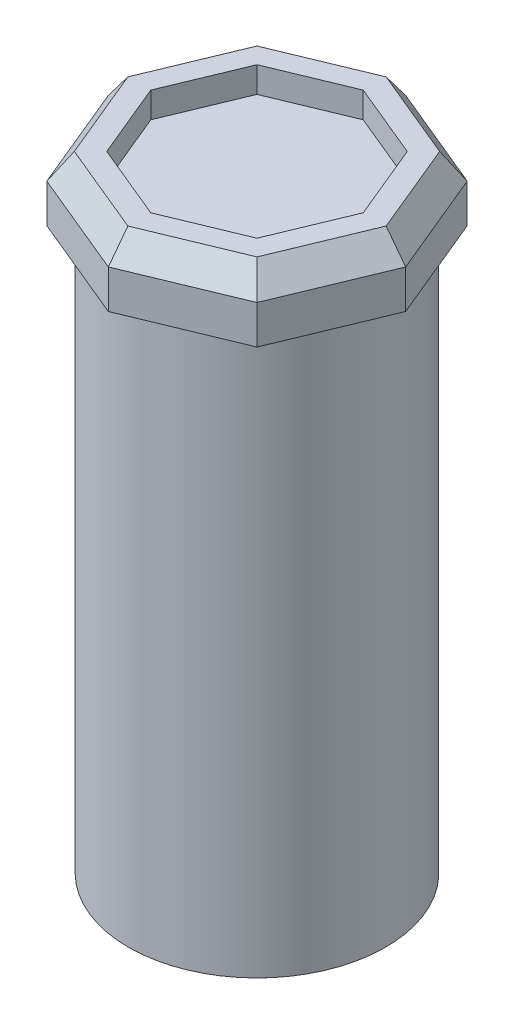
ISO-10303-21;
HEADER;
FILE_DESCRIPTION(('STEP AP214'),'2;1');
FILE_NAME('part.step','',(''),(''),'','','');
FILE_SCHEMA(('AUTOMOTIVE_DESIGN { 1 0 10303 214 1 1 1 1 }'));
ENDSEC;
DATA;
#1=APPLICATION_CONTEXT('core data for automotive mechanical design processes');
#2=APPLICATION_PROTOCOL_DEFINITION('international standard','automotive_design',2000,#1);
#3=PRODUCT_CONTEXT('',#1,'mechanical');
#4=PRODUCT('Part','Part','',(#3));
#5=PRODUCT_RELATED_PRODUCT_CATEGORY('part','',(#4));
#6=PRODUCT_DEFINITION_FORMATION('','',#4);
#7=PRODUCT_DEFINITION_CONTEXT('part definition',#1,'design');
#8=PRODUCT_DEFINITION('design','',#6,#7);
#9=PRODUCT_DEFINITION_SHAPE('','',#8);
#10=(LENGTH_UNIT() NAMED_UNIT(*) SI_UNIT(.MILLI.,.METRE.));
#11=(NAMED_UNIT(*) PLANE_ANGLE_UNIT() SI_UNIT($,.RADIAN.));
#12=(NAMED_UNIT(*) SI_UNIT($,.STERADIAN.) SOLID_ANGLE_UNIT());
#13=UNCERTAINTY_MEASURE_WITH_UNIT(LENGTH_MEASURE(1.E-05),#10,'distance_accuracy_value','');
#14=(GEOMETRIC_REPRESENTATION_CONTEXT(3) GLOBAL_UNCERTAINTY_ASSIGNED_CONTEXT((#13)) GLOBAL_UNIT_ASSIGNED_CONTEXT((#10,
#11,#12)) REPRESENTATION_CONTEXT('',''));
#15=CARTESIAN_POINT('',(0.,0.,0.));
#16=DIRECTION('',(0.,0.,1.));
#17=DIRECTION('',(1.,0.,0.));
#18=AXIS2_PLACEMENT_3D('',#15,#16,#17);
#19=CARTESIAN_POINT('',(0.,57.15,0.));
#20=DIRECTION('',(0.,-1.,0.));
#21=DIRECTION('',(0.,0.,-1.));
#22=AXIS2_PLACEMENT_3D('',#19,#20,#21);
#23=CYLINDRICAL_SURFACE('',#22,12.7);
#24=CARTESIAN_POINT('',(0.,1.77852714705266,0.));
#25=DIRECTION('',(0.,1.,0.));
#26=DIRECTION('',(0.,0.,1.));
#27=AXIS2_PLACEMENT_3D('',#24,#25,#26);
#28=CIRCLE('',#27,12.7);
#29=CARTESIAN_POINT('',(0.,1.77852714705266,12.7));
#30=VERTEX_POINT('',#29);
#31=EDGE_CURVE('E40',#30,#30,#28,.T.);
#32=ORIENTED_EDGE('',*,*,#31,.T.);
#33=EDGE_LOOP('',(#32));
#34=FACE_BOUND('',#33,.T.);
#35=CARTESIAN_POINT('',(0.,57.15,0.));
#36=DIRECTION('',(0.,1.,0.));
#37=DIRECTION('',(0.,0.,1.));
#38=AXIS2_PLACEMENT_3D('',#35,#36,#37);
#39=CIRCLE('',#38,12.7);
#40=CARTESIAN_POINT('',(0.,57.15,12.7));
#41=VERTEX_POINT('',#40);
#42=EDGE_CURVE('E282',#41,#41,#39,.T.);
#43=ORIENTED_EDGE('',*,*,#42,.F.);
#44=EDGE_LOOP('',(#43));
#45=FACE_BOUND('',#44,.T.);
#46=ADVANCED_FACE('F32',(#34,#45),#23,.T.);
#47=CARTESIAN_POINT('',(0.,0.,0.));
#48=DIRECTION('',(0.,1.,0.));
#49=DIRECTION('',(0.,0.,1.));
#50=AXIS2_PLACEMENT_3D('',#47,#48,#49);
#51=PLANE('',#50);
#52=CARTESIAN_POINT('',(0.,0.,0.));
#53=DIRECTION('',(0.,1.,0.));
#54=DIRECTION('',(0.,0.,1.));
#55=AXIS2_PLACEMENT_3D('',#52,#53,#54);
#56=CIRCLE('',#55,10.16);
#57=CARTESIAN_POINT('',(0.,0.,10.16));
#58=VERTEX_POINT('',#57);
#59=EDGE_CURVE('E11',#58,#58,#56,.F.);
#60=ORIENTED_EDGE('',*,*,#59,.T.);
#61=EDGE_LOOP('',(#60));
#62=FACE_BOUND('',#61,.T.);
#63=ADVANCED_FACE('F350',(#62),#51,.F.);
#64=CARTESIAN_POINT('',(10.3813328711158,63.5,-10.3813328711161));
#65=DIRECTION('',(-0.382683432365079,0.,0.923879532511291));
#66=DIRECTION('',(0.923879532511292,0.,0.382683432365079));
#67=AXIS2_PLACEMENT_3D('',#64,#65,#66);
#68=PLANE('',#67);
#69=DIRECTION('',(0.,-1.,0.));
#70=VECTOR('',#69,1.);
#71=CARTESIAN_POINT('',(-1.73472347597681E-13,63.5,-14.6814217418418));
#72=LINE('',#71,#70);
#73=CARTESIAN_POINT('',(-1.73472347597681E-13,60.96,-14.6814217418418));
#74=VERTEX_POINT('',#73);
#75=CARTESIAN_POINT('',(-1.73472347597681E-13,57.15,-14.6814217418418));
#76=VERTEX_POINT('',#75);
#77=EDGE_CURVE('E280',#74,#76,#72,.T.);
#78=ORIENTED_EDGE('',*,*,#77,.F.);
#79=DIRECTION('',(0.923879532511292,0.,0.382683432365079));
#80=VECTOR('',#79,1.);
#81=CARTESIAN_POINT('',(10.3813328711158,60.96,-10.3813328711161));
#82=LINE('',#81,#80);
#83=CARTESIAN_POINT('',(10.3813328711158,60.96,-10.3813328711161));
#84=VERTEX_POINT('',#83);
#85=EDGE_CURVE('E316',#74,#84,#82,.T.);
#86=ORIENTED_EDGE('',*,*,#85,.T.);
#87=DIRECTION('',(0.,-1.,0.));
#88=VECTOR('',#87,1.);
#89=CARTESIAN_POINT('',(10.3813328711158,63.5,-10.3813328711161));
#90=LINE('',#89,#88);
#91=CARTESIAN_POINT('',(10.3813328711158,57.15,-10.3813328711161));
#92=VERTEX_POINT('',#91);
#93=EDGE_CURVE('E266',#84,#92,#90,.T.);
#94=ORIENTED_EDGE('',*,*,#93,.T.);
#95=DIRECTION('',(-0.923879532511291,0.,-0.382683432365079));
#96=VECTOR('',#95,1.);
#97=CARTESIAN_POINT('',(10.3813328711158,57.15,-10.3813328711161));
#98=LINE('',#97,#96);
#99=EDGE_CURVE('E241',#92,#76,#98,.T.);
#100=ORIENTED_EDGE('',*,*,#99,.T.);
#101=EDGE_LOOP('',(#78,#86,#94,#100));
#102=FACE_BOUND('',#101,.T.);
#103=ADVANCED_FACE('F355',(#102),#68,.F.);
#104=CARTESIAN_POINT('',(-1.73472347597681E-13,63.5,-14.6814217418418));
#105=DIRECTION('',(0.3826834323651,0.,0.923879532511282));
#106=DIRECTION('',(0.923879532511283,0.,-0.3826834323651));
#107=AXIS2_PLACEMENT_3D('',#104,#105,#106);
#108=PLANE('',#107);
#109=DIRECTION('',(0.,-1.,0.));
#110=VECTOR('',#109,1.);
#111=CARTESIAN_POINT('',(-10.3813328711161,63.5,-10.3813328711158));
#112=LINE('',#111,#110);
#113=CARTESIAN_POINT('',(-10.3813328711161,60.96,-10.3813328711158));
#114=VERTEX_POINT('',#113);
#115=CARTESIAN_POINT('',(-10.3813328711161,57.15,-10.3813328711158));
#116=VERTEX_POINT('',#115);
#117=EDGE_CURVE('E278',#114,#116,#112,.T.);
#118=ORIENTED_EDGE('',*,*,#117,.F.);
#119=DIRECTION('',(0.923879532511283,0.,-0.3826834323651));
#120=VECTOR('',#119,1.);
#121=CARTESIAN_POINT('',(-1.73393357680795E-13,60.96,-14.6814217418418));
#122=LINE('',#121,#120);
#123=EDGE_CURVE('E55',#114,#74,#122,.T.);
#124=ORIENTED_EDGE('',*,*,#123,.T.);
#125=ORIENTED_EDGE('',*,*,#77,.T.);
#126=DIRECTION('',(-0.923879532511282,0.,0.3826834323651));
#127=VECTOR('',#126,1.);
#128=CARTESIAN_POINT('',(-1.73472347597681E-13,57.15,-14.6814217418418));
#129=LINE('',#128,#127);
#130=EDGE_CURVE('E244',#76,#116,#129,.T.);
#131=ORIENTED_EDGE('',*,*,#130,.T.);
#132=EDGE_LOOP('',(#118,#124,#125,#131));
#133=FACE_BOUND('',#132,.T.);
#134=ADVANCED_FACE('F407',(#133),#108,.F.);
#135=CARTESIAN_POINT('',(-10.3813328711161,63.5,-10.3813328711158));
#136=DIRECTION('',(0.923879532511292,0.,0.382683432365079));
#137=DIRECTION('',(0.382683432365079,0.,-0.923879532511291));
#138=AXIS2_PLACEMENT_3D('',#135,#136,#137);
#139=PLANE('',#138);
#140=DIRECTION('',(0.,-1.,0.));
#141=VECTOR('',#140,1.);
#142=CARTESIAN_POINT('',(-14.6814217418418,63.5,1.75207071073658E-13));
#143=LINE('',#142,#141);
#144=CARTESIAN_POINT('',(-14.6814217418418,60.96,1.75207071073658E-13));
#145=VERTEX_POINT('',#144);
#146=CARTESIAN_POINT('',(-14.6814217418418,57.15,1.75207071073658E-13));
#147=VERTEX_POINT('',#146);
#148=EDGE_CURVE('E276',#145,#147,#143,.T.);
#149=ORIENTED_EDGE('',*,*,#148,.F.);
#150=DIRECTION('',(0.382683432365079,0.,-0.923879532511291));
#151=VECTOR('',#150,1.);
#152=CARTESIAN_POINT('',(-10.3813328711161,60.96,-10.3813328711158));
#153=LINE('',#152,#151);
#154=EDGE_CURVE('E313',#145,#114,#153,.T.);
#155=ORIENTED_EDGE('',*,*,#154,.T.);
#156=ORIENTED_EDGE('',*,*,#117,.T.);
#157=DIRECTION('',(-0.382683432365079,0.,0.923879532511291));
#158=VECTOR('',#157,1.);
#159=CARTESIAN_POINT('',(-10.3813328711161,57.15,-10.3813328711158));
#160=LINE('',#159,#158);
#161=EDGE_CURVE('E248',#116,#147,#160,.T.);
#162=ORIENTED_EDGE('',*,*,#161,.T.);
#163=EDGE_LOOP('',(#149,#155,#156,#162));
#164=FACE_BOUND('',#163,.T.);
#165=ADVANCED_FACE('F406',(#164),#139,.F.);
#166=CARTESIAN_POINT('',(-14.6814217418418,63.5,1.75207071073658E-13));
#167=DIRECTION('',(0.923879532511282,0.,-0.382683432365101));
#168=DIRECTION('',(-0.382683432365101,0.,-0.923879532511282));
#169=AXIS2_PLACEMENT_3D('',#166,#167,#168);
#170=PLANE('',#169);
#171=DIRECTION('',(0.,-1.,0.));
#172=VECTOR('',#171,1.);
#173=CARTESIAN_POINT('',(-10.3813328711158,63.5,10.3813328711161));
#174=LINE('',#173,#172);
#175=CARTESIAN_POINT('',(-10.3813328711158,60.96,10.3813328711161));
#176=VERTEX_POINT('',#175);
#177=CARTESIAN_POINT('',(-10.3813328711158,57.15,10.3813328711161));
#178=VERTEX_POINT('',#177);
#179=EDGE_CURVE('E274',#176,#178,#174,.T.);
#180=ORIENTED_EDGE('',*,*,#179,.F.);
#181=DIRECTION('',(-0.382683432365101,0.,-0.923879532511282));
#182=VECTOR('',#181,1.);
#183=CARTESIAN_POINT('',(-14.6814217418418,60.96,1.75202611824805E-13));
#184=LINE('',#183,#182);
#185=EDGE_CURVE('E311',#176,#145,#184,.T.);
#186=ORIENTED_EDGE('',*,*,#185,.T.);
#187=ORIENTED_EDGE('',*,*,#148,.T.);
#188=DIRECTION('',(0.3826834323651,0.,0.923879532511282));
#189=VECTOR('',#188,1.);
#190=CARTESIAN_POINT('',(-14.6814217418418,57.15,1.75207071073658E-13));
#191=LINE('',#190,#189);
#192=EDGE_CURVE('E251',#147,#178,#191,.T.);
#193=ORIENTED_EDGE('',*,*,#192,.T.);
#194=EDGE_LOOP('',(#180,#186,#187,#193));
#195=FACE_BOUND('',#194,.T.);
#196=ADVANCED_FACE('F417',(#195),#170,.F.);
#197=CARTESIAN_POINT('',(-10.3813328711158,63.5,10.3813328711161));
#198=DIRECTION('',(0.382683432365079,0.,-0.923879532511291));
#199=DIRECTION('',(-0.923879532511291,0.,-0.382683432365079));
#200=AXIS2_PLACEMENT_3D('',#197,#198,#199);
#201=PLANE('',#200);
#202=DIRECTION('',(0.,-1.,0.));
#203=VECTOR('',#202,1.);
#204=CARTESIAN_POINT('',(1.7171259852657E-13,63.5,14.6814217418418));
#205=LINE('',#204,#203);
#206=CARTESIAN_POINT('',(1.7171259852657E-13,60.96,14.6814217418418));
#207=VERTEX_POINT('',#206);
#208=CARTESIAN_POINT('',(1.7171259852657E-13,57.15,14.6814217418418));
#209=VERTEX_POINT('',#208);
#210=EDGE_CURVE('E272',#207,#209,#205,.T.);
#211=ORIENTED_EDGE('',*,*,#210,.F.);
#212=DIRECTION('',(-0.923879532511291,0.,-0.382683432365079));
#213=VECTOR('',#212,1.);
#214=CARTESIAN_POINT('',(-10.3813328711158,60.96,10.3813328711161));
#215=LINE('',#214,#213);
#216=EDGE_CURVE('E309',#207,#176,#215,.T.);
#217=ORIENTED_EDGE('',*,*,#216,.T.);
#218=ORIENTED_EDGE('',*,*,#179,.T.);
#219=DIRECTION('',(0.923879532511291,0.,0.382683432365079));
#220=VECTOR('',#219,1.);
#221=CARTESIAN_POINT('',(-10.3813328711158,57.15,10.3813328711161));
#222=LINE('',#221,#220);
#223=EDGE_CURVE('E254',#178,#209,#222,.T.);
#224=ORIENTED_EDGE('',*,*,#223,.T.);
#225=EDGE_LOOP('',(#211,#217,#218,#224));
#226=FACE_BOUND('',#225,.T.);
#227=ADVANCED_FACE('F420',(#226),#201,.F.);
#228=CARTESIAN_POINT('',(1.7171259852657E-13,63.5,14.6814217418418));
#229=DIRECTION('',(-0.3826834323651,0.,-0.923879532511282));
#230=DIRECTION('',(-0.923879532511283,0.,0.3826834323651));
#231=AXIS2_PLACEMENT_3D('',#228,#229,#230);
#232=PLANE('',#231);
#233=DIRECTION('',(0.,-1.,0.));
#234=VECTOR('',#233,1.);
#235=CARTESIAN_POINT('',(10.3813328711161,63.5,10.3813328711158));
#236=LINE('',#235,#234);
#237=CARTESIAN_POINT('',(10.3813328711161,60.96,10.3813328711158));
#238=VERTEX_POINT('',#237);
#239=CARTESIAN_POINT('',(10.3813328711161,57.15,10.3813328711158));
#240=VERTEX_POINT('',#239);
#241=EDGE_CURVE('E270',#238,#240,#236,.T.);
#242=ORIENTED_EDGE('',*,*,#241,.F.);
#243=DIRECTION('',(-0.923879532511283,0.,0.3826834323651));
#244=VECTOR('',#243,1.);
#245=CARTESIAN_POINT('',(1.71735290257609E-13,60.96,14.6814217418418));
#246=LINE('',#245,#244);
#247=EDGE_CURVE('E307',#238,#207,#246,.T.);
#248=ORIENTED_EDGE('',*,*,#247,.T.);
#249=ORIENTED_EDGE('',*,*,#210,.T.);
#250=DIRECTION('',(0.923879532511283,0.,-0.3826834323651));
#251=VECTOR('',#250,1.);
#252=CARTESIAN_POINT('',(1.7171259852657E-13,57.15,14.6814217418418));
#253=LINE('',#252,#251);
#254=EDGE_CURVE('E257',#209,#240,#253,.T.);
#255=ORIENTED_EDGE('',*,*,#254,.T.);
#256=EDGE_LOOP('',(#242,#248,#249,#255));
#257=FACE_BOUND('',#256,.T.);
#258=ADVANCED_FACE('F448',(#257),#232,.F.);
#259=CARTESIAN_POINT('',(10.3813328711161,63.5,10.3813328711158));
#260=DIRECTION('',(-0.923879532511291,0.,-0.38268343236508));
#261=DIRECTION('',(-0.38268343236508,0.,0.923879532511291));
#262=AXIS2_PLACEMENT_3D('',#259,#260,#261);
#263=PLANE('',#262);
#264=DIRECTION('',(0.,-1.,0.));
#265=VECTOR('',#264,1.);
#266=CARTESIAN_POINT('',(14.6814217418418,63.5,-1.72236999851446E-13));
#267=LINE('',#266,#265);
#268=CARTESIAN_POINT('',(14.6814217418418,60.96,-1.72236999851446E-13));
#269=VERTEX_POINT('',#268);
#270=CARTESIAN_POINT('',(14.6814217418418,57.15,-1.72236999851446E-13));
#271=VERTEX_POINT('',#270);
#272=EDGE_CURVE('E268',#269,#271,#267,.T.);
#273=ORIENTED_EDGE('',*,*,#272,.F.);
#274=DIRECTION('',(-0.38268343236508,0.,0.923879532511291));
#275=VECTOR('',#274,1.);
#276=CARTESIAN_POINT('',(10.3813328711161,60.96,10.3813328711158));
#277=LINE('',#276,#275);
#278=EDGE_CURVE('E305',#269,#238,#277,.T.);
#279=ORIENTED_EDGE('',*,*,#278,.T.);
#280=ORIENTED_EDGE('',*,*,#241,.T.);
#281=DIRECTION('',(0.38268343236508,0.,-0.923879532511291));
#282=VECTOR('',#281,1.);
#283=CARTESIAN_POINT('',(10.3813328711161,57.15,10.3813328711158));
#284=LINE('',#283,#282);
#285=EDGE_CURVE('E260',#240,#271,#284,.T.);
#286=ORIENTED_EDGE('',*,*,#285,.T.);
#287=EDGE_LOOP('',(#273,#279,#280,#286));
#288=FACE_BOUND('',#287,.T.);
#289=ADVANCED_FACE('F446',(#288),#263,.F.);
#290=CARTESIAN_POINT('',(14.6814217418418,63.5,-1.72236999851446E-13));
#291=DIRECTION('',(-0.923879532511282,0.,0.382683432365101));
#292=DIRECTION('',(0.382683432365101,0.,0.923879532511282));
#293=AXIS2_PLACEMENT_3D('',#290,#291,#292);
#294=PLANE('',#293);
#295=ORIENTED_EDGE('',*,*,#93,.F.);
#296=DIRECTION('',(0.382683432365101,0.,0.923879532511282));
#297=VECTOR('',#296,1.);
#298=CARTESIAN_POINT('',(14.6814217418418,60.96,-1.72268127554789E-13));
#299=LINE('',#298,#297);
#300=EDGE_CURVE('E302',#84,#269,#299,.T.);
#301=ORIENTED_EDGE('',*,*,#300,.T.);
#302=ORIENTED_EDGE('',*,*,#272,.T.);
#303=DIRECTION('',(-0.382683432365101,0.,-0.923879532511282));
#304=VECTOR('',#303,1.);
#305=CARTESIAN_POINT('',(14.6814217418418,57.15,-1.72236999851446E-13));
#306=LINE('',#305,#304);
#307=EDGE_CURVE('E263',#271,#92,#306,.T.);
#308=ORIENTED_EDGE('',*,*,#307,.T.);
#309=EDGE_LOOP('',(#295,#301,#302,#308));
#310=FACE_BOUND('',#309,.T.);
#311=ADVANCED_FACE('F439',(#310),#294,.F.);
#312=CARTESIAN_POINT('',(0.,63.5,0.));
#313=DIRECTION('',(0.,1.,0.));
#314=DIRECTION('',(0.,0.,1.));
#315=AXIS2_PLACEMENT_3D('',#312,#313,#314);
#316=PLANE('',#315);
#317=DIRECTION('',(-0.923879532511291,0.,-0.382683432365079));
#318=VECTOR('',#317,1.);
#319=CARTESIAN_POINT('',(7.41974752114686,63.5,-7.41974752114703));
#320=LINE('',#319,#318);
#321=CARTESIAN_POINT('',(7.41974752114686,63.5,-7.41974752114703));
#322=VERTEX_POINT('',#321);
#323=CARTESIAN_POINT('',(-1.22731685925359E-13,63.5,-10.4931075737902));
#324=VERTEX_POINT('',#323);
#325=EDGE_CURVE('E47',#322,#324,#320,.T.);
#326=ORIENTED_EDGE('',*,*,#325,.F.);
#327=DIRECTION('',(-0.3826834323651,0.,-0.923879532511283));
#328=VECTOR('',#327,1.);
#329=CARTESIAN_POINT('',(10.4931075737902,63.5,-1.21164632623003E-13));
#330=LINE('',#329,#328);
#331=CARTESIAN_POINT('',(10.4931075737902,63.5,-1.21164632623003E-13));
#332=VERTEX_POINT('',#331);
#333=EDGE_CURVE('E191',#332,#322,#330,.T.);
#334=ORIENTED_EDGE('',*,*,#333,.F.);
#335=DIRECTION('',(0.382683432365079,0.,-0.923879532511291));
#336=VECTOR('',#335,1.);
#337=CARTESIAN_POINT('',(7.41974752114703,63.5,7.41974752114686));
#338=LINE('',#337,#336);
#339=CARTESIAN_POINT('',(7.41974752114703,63.5,7.41974752114686));
#340=VERTEX_POINT('',#339);
#341=EDGE_CURVE('E194',#340,#332,#338,.T.);
#342=ORIENTED_EDGE('',*,*,#341,.F.);
#343=DIRECTION('',(0.923879532511283,0.,-0.3826834323651));
#344=VECTOR('',#343,1.);
#345=CARTESIAN_POINT('',(1.22406693644896E-13,63.5,10.4931075737902));
#346=LINE('',#345,#344);
#347=CARTESIAN_POINT('',(1.22406693644896E-13,63.5,10.4931075737902));
#348=VERTEX_POINT('',#347);
#349=EDGE_CURVE('E222',#348,#340,#346,.T.);
#350=ORIENTED_EDGE('',*,*,#349,.F.);
#351=DIRECTION('',(0.923879532511291,0.,0.382683432365079));
#352=VECTOR('',#351,1.);
#353=CARTESIAN_POINT('',(-7.41974752114686,63.5,7.41974752114703));
#354=LINE('',#353,#352);
#355=CARTESIAN_POINT('',(-7.41974752114686,63.5,7.41974752114703));
#356=VERTEX_POINT('',#355);
#357=EDGE_CURVE('E219',#356,#348,#354,.T.);
#358=ORIENTED_EDGE('',*,*,#357,.F.);
#359=DIRECTION('',(0.3826834323651,0.,0.923879532511283));
#360=VECTOR('',#359,1.);
#361=CARTESIAN_POINT('',(-10.4931075737902,63.5,1.24032728532342E-13));
#362=LINE('',#361,#360);
#363=CARTESIAN_POINT('',(-10.4931075737902,63.5,1.24032728532342E-13));
#364=VERTEX_POINT('',#363);
#365=EDGE_CURVE('E216',#364,#356,#362,.T.);
#366=ORIENTED_EDGE('',*,*,#365,.F.);
#367=DIRECTION('',(-0.382683432365079,0.,0.923879532511292));
#368=VECTOR('',#367,1.);
#369=CARTESIAN_POINT('',(-7.41974752114703,63.5,-7.41974752114686));
#370=LINE('',#369,#368);
#371=CARTESIAN_POINT('',(-7.41974752114703,63.5,-7.41974752114686));
#372=VERTEX_POINT('',#371);
#373=EDGE_CURVE('E213',#372,#364,#370,.T.);
#374=ORIENTED_EDGE('',*,*,#373,.F.);
#375=DIRECTION('',(-0.923879532511282,0.,0.3826834323651));
#376=VECTOR('',#375,1.);
#377=CARTESIAN_POINT('',(-1.23165366794353E-13,63.5,-10.4931075737902));
#378=LINE('',#377,#376);
#379=EDGE_CURVE('E211',#324,#372,#378,.T.);
#380=ORIENTED_EDGE('',*,*,#379,.F.);
#381=EDGE_LOOP('',(#326,#334,#342,#350,#358,#366,#374,#380));
#382=FACE_BOUND('',#381,.T.);
#383=DIRECTION('',(0.38268343236508,0.,-0.923879532511291));
#384=VECTOR('',#383,1.);
#385=CARTESIAN_POINT('',(13.0382769126641,63.5,-0.680612873188761));
#386=LINE('',#385,#384);
#387=CARTESIAN_POINT('',(9.02010712473884,63.5,9.02010712473863));
#388=VERTEX_POINT('',#387);
#389=CARTESIAN_POINT('',(12.7563578298637,63.5,-1.47946348299118E-13));
#390=VERTEX_POINT('',#389);
#391=EDGE_CURVE('E297',#388,#390,#386,.T.);
#392=ORIENTED_EDGE('',*,*,#391,.T.);
#393=DIRECTION('',(-0.382683432365101,0.,-0.923879532511282));
#394=VECTOR('',#393,1.);
#395=CARTESIAN_POINT('',(8.73818804193818,63.5,-9.70071999792745));
#396=LINE('',#395,#394);
#397=CARTESIAN_POINT('',(9.02010712473863,63.5,-9.02010712473884));
#398=VERTEX_POINT('',#397);
#399=EDGE_CURVE('E299',#390,#398,#396,.T.);
#400=ORIENTED_EDGE('',*,*,#399,.T.);
#401=DIRECTION('',(-0.923879532511291,0.,-0.382683432365079));
#402=VECTOR('',#401,1.);
#403=CARTESIAN_POINT('',(-0.680612873188762,63.5,-13.0382769126641));
#404=LINE('',#403,#402);
#405=CARTESIAN_POINT('',(-1.55748699965786E-13,63.5,-12.7563578298637));
#406=VERTEX_POINT('',#405);
#407=EDGE_CURVE('E285',#398,#406,#404,.T.);
#408=ORIENTED_EDGE('',*,*,#407,.T.);
#409=DIRECTION('',(-0.923879532511282,0.,0.3826834323651));
#410=VECTOR('',#409,1.);
#411=CARTESIAN_POINT('',(-9.70071999792744,63.5,-8.73818804193819));
#412=LINE('',#411,#410);
#413=CARTESIAN_POINT('',(-9.02010712473884,63.5,-9.02010712473863));
#414=VERTEX_POINT('',#413);
#415=EDGE_CURVE('E287',#406,#414,#412,.T.);
#416=ORIENTED_EDGE('',*,*,#415,.T.);
#417=DIRECTION('',(-0.382683432365079,0.,0.923879532511291));
#418=VECTOR('',#417,1.);
#419=CARTESIAN_POINT('',(-13.0382769126641,63.5,0.680612873188764));
#420=LINE('',#419,#418);
#421=CARTESIAN_POINT('',(-12.7563578298637,63.5,1.56386850020282E-13));
#422=VERTEX_POINT('',#421);
#423=EDGE_CURVE('E289',#414,#422,#420,.T.);
#424=ORIENTED_EDGE('',*,*,#423,.T.);
#425=DIRECTION('',(0.382683432365101,0.,0.923879532511282));
#426=VECTOR('',#425,1.);
#427=CARTESIAN_POINT('',(-8.73818804193818,63.5,9.70071999792744));
#428=LINE('',#427,#426);
#429=CARTESIAN_POINT('',(-9.02010712473863,63.5,9.02010712473884));
#430=VERTEX_POINT('',#429);
#431=EDGE_CURVE('E291',#422,#430,#428,.T.);
#432=ORIENTED_EDGE('',*,*,#431,.T.);
#433=DIRECTION('',(0.923879532511291,0.,0.382683432365079));
#434=VECTOR('',#433,1.);
#435=CARTESIAN_POINT('',(0.68061287318876,63.5,13.0382769126641));
#436=LINE('',#435,#434);
#437=CARTESIAN_POINT('',(1.46343194696891E-13,63.5,12.7563578298637));
#438=VERTEX_POINT('',#437);
#439=EDGE_CURVE('E293',#430,#438,#436,.T.);
#440=ORIENTED_EDGE('',*,*,#439,.T.);
#441=DIRECTION('',(0.923879532511283,0.,-0.3826834323651));
#442=VECTOR('',#441,1.);
#443=CARTESIAN_POINT('',(9.70071999792743,63.5,8.73818804193819));
#444=LINE('',#443,#442);
#445=EDGE_CURVE('E295',#438,#388,#444,.T.);
#446=ORIENTED_EDGE('',*,*,#445,.T.);
#447=EDGE_LOOP('',(#392,#400,#408,#416,#424,#432,#440,#446));
#448=FACE_BOUND('',#447,.T.);
#449=ADVANCED_FACE('F394',(#382,#448),#316,.T.);
#450=CARTESIAN_POINT('',(0.,57.15,0.));
#451=DIRECTION('',(0.,1.,0.));
#452=DIRECTION('',(0.,0.,1.));
#453=AXIS2_PLACEMENT_3D('',#450,#451,#452);
#454=PLANE('',#453);
#455=ORIENTED_EDGE('',*,*,#42,.T.);
#456=EDGE_LOOP('',(#455));
#457=FACE_BOUND('',#456,.T.);
#458=ORIENTED_EDGE('',*,*,#99,.F.);
#459=ORIENTED_EDGE('',*,*,#307,.F.);
#460=ORIENTED_EDGE('',*,*,#285,.F.);
#461=ORIENTED_EDGE('',*,*,#254,.F.);
#462=ORIENTED_EDGE('',*,*,#223,.F.);
#463=ORIENTED_EDGE('',*,*,#192,.F.);
#464=ORIENTED_EDGE('',*,*,#161,.F.);
#465=ORIENTED_EDGE('',*,*,#130,.F.);
#466=EDGE_LOOP('',(#458,#459,#460,#461,#462,#463,#464,#465));
#467=FACE_BOUND('',#466,.T.);
#468=ADVANCED_FACE('F389',(#457,#467),#454,.F.);
#469=CARTESIAN_POINT('',(-10.8882324773012,63.5,4.5100535623695));
#470=DIRECTION('',(-0.756797807733376,0.573576436351045,0.313475915937401));
#471=DIRECTION('',(-0.382683432365101,0.,-0.923879532511282));
#472=AXIS2_PLACEMENT_3D('',#469,#470,#471);
#473=PLANE('',#472);
#474=DIRECTION('',(0.604021441856795,0.79696806571985,0.));
#475=VECTOR('',#474,1.);
#476=CARTESIAN_POINT('',(-12.0747874226442,64.399289017661,1.50053580671994E-13));
#477=LINE('',#476,#475);
#478=EDGE_CURVE('E333',#145,#422,#477,.T.);
#479=ORIENTED_EDGE('',*,*,#478,.F.);
#480=ORIENTED_EDGE('',*,*,#185,.F.);
#481=DIRECTION('',(0.42710765751901,0.79696806571985,-0.427107657519021));
#482=VECTOR('',#481,1.);
#483=CARTESIAN_POINT('',(-8.53816406793768,64.399289017661,8.53816406793787));
#484=LINE('',#483,#482);
#485=EDGE_CURVE('E245',#430,#176,#484,.F.);
#486=ORIENTED_EDGE('',*,*,#485,.F.);
#487=ORIENTED_EDGE('',*,*,#431,.F.);
#488=EDGE_LOOP('',(#479,#480,#486,#487));
#489=FACE_BOUND('',#488,.T.);
#490=ADVANCED_FACE('F386',(#489),#473,.T.);
#491=CARTESIAN_POINT('',(-4.51005356236924,63.5,10.8882324773013));
#492=DIRECTION('',(-0.313475915937383,0.573576436351045,0.756797807733383));
#493=DIRECTION('',(-0.923879532511291,0.,-0.382683432365079));
#494=AXIS2_PLACEMENT_3D('',#491,#492,#493);
#495=PLANE('',#494);
#496=ORIENTED_EDGE('',*,*,#485,.T.);
#497=ORIENTED_EDGE('',*,*,#216,.F.);
#498=DIRECTION('',(0.,0.79696806571985,-0.604021441856795));
#499=VECTOR('',#498,1.);
#500=CARTESIAN_POINT('',(1.38777878078145E-13,64.399289017661,12.0747874226442));
#501=LINE('',#500,#499);
#502=EDGE_CURVE('E330',#438,#207,#501,.F.);
#503=ORIENTED_EDGE('',*,*,#502,.F.);
#504=ORIENTED_EDGE('',*,*,#439,.F.);
#505=EDGE_LOOP('',(#496,#497,#503,#504));
#506=FACE_BOUND('',#505,.T.);
#507=ADVANCED_FACE('F383',(#506),#495,.T.);
#508=CARTESIAN_POINT('',(-10.8882324773013,63.5,-4.51005356236924));
#509=DIRECTION('',(-0.756797807733383,0.573576436351045,-0.313475915937383));
#510=DIRECTION('',(0.382683432365079,0.,-0.923879532511291));
#511=AXIS2_PLACEMENT_3D('',#508,#509,#510);
#512=PLANE('',#511);
#513=ORIENTED_EDGE('',*,*,#478,.T.);
#514=ORIENTED_EDGE('',*,*,#423,.F.);
#515=DIRECTION('',(0.427107657519021,0.79696806571985,0.427107657519009));
#516=VECTOR('',#515,1.);
#517=CARTESIAN_POINT('',(-8.53816406793787,64.399289017661,-8.53816406793768));
#518=LINE('',#517,#516);
#519=EDGE_CURVE('E327',#114,#414,#518,.T.);
#520=ORIENTED_EDGE('',*,*,#519,.F.);
#521=ORIENTED_EDGE('',*,*,#154,.F.);
#522=EDGE_LOOP('',(#513,#514,#520,#521));
#523=FACE_BOUND('',#522,.T.);
#524=ADVANCED_FACE('F379',(#523),#512,.T.);
#525=CARTESIAN_POINT('',(4.51005356236949,63.5,10.8882324773012));
#526=DIRECTION('',(0.3134759159374,0.573576436351045,0.756797807733376));
#527=DIRECTION('',(-0.923879532511283,0.,0.3826834323651));
#528=AXIS2_PLACEMENT_3D('',#525,#526,#527);
#529=PLANE('',#528);
#530=ORIENTED_EDGE('',*,*,#502,.T.);
#531=ORIENTED_EDGE('',*,*,#247,.F.);
#532=DIRECTION('',(-0.427107657519019,0.79696806571985,-0.427107657519012));
#533=VECTOR('',#532,1.);
#534=CARTESIAN_POINT('',(8.53816406793787,64.399289017661,8.53816406793768));
#535=LINE('',#534,#533);
#536=EDGE_CURVE('E324',#388,#238,#535,.F.);
#537=ORIENTED_EDGE('',*,*,#536,.F.);
#538=ORIENTED_EDGE('',*,*,#445,.F.);
#539=EDGE_LOOP('',(#530,#531,#537,#538));
#540=FACE_BOUND('',#539,.T.);
#541=ADVANCED_FACE('F375',(#540),#529,.T.);
#542=CARTESIAN_POINT('',(-4.51005356236949,63.5,-10.8882324773012));
#543=DIRECTION('',(-0.313475915937401,0.573576436351044,-0.756797807733376));
#544=DIRECTION('',(0.923879532511283,0.,-0.3826834323651));
#545=AXIS2_PLACEMENT_3D('',#542,#543,#544);
#546=PLANE('',#545);
#547=ORIENTED_EDGE('',*,*,#519,.T.);
#548=ORIENTED_EDGE('',*,*,#415,.F.);
#549=DIRECTION('',(0.,0.79696806571985,0.604021441856794));
#550=VECTOR('',#549,1.);
#551=CARTESIAN_POINT('',(-1.47451495458029E-13,64.399289017661,-12.0747874226442));
#552=LINE('',#551,#550);
#553=EDGE_CURVE('E321',#74,#406,#552,.T.);
#554=ORIENTED_EDGE('',*,*,#553,.F.);
#555=ORIENTED_EDGE('',*,*,#123,.F.);
#556=EDGE_LOOP('',(#547,#548,#554,#555));
#557=FACE_BOUND('',#556,.T.);
#558=ADVANCED_FACE('F371',(#557),#546,.T.);
#559=CARTESIAN_POINT('',(10.8882324773013,63.5,4.51005356236925));
#560=DIRECTION('',(0.756797807733383,0.573576436351044,0.313475915937383));
#561=DIRECTION('',(-0.38268343236508,0.,0.923879532511291));
#562=AXIS2_PLACEMENT_3D('',#559,#560,#561);
#563=PLANE('',#562);
#564=ORIENTED_EDGE('',*,*,#536,.T.);
#565=ORIENTED_EDGE('',*,*,#278,.F.);
#566=DIRECTION('',(-0.604021441856794,0.79696806571985,0.));
#567=VECTOR('',#566,1.);
#568=CARTESIAN_POINT('',(12.0747874226442,64.399289017661,-1.37910516340156E-13));
#569=LINE('',#568,#567);
#570=EDGE_CURVE('E319',#390,#269,#569,.F.);
#571=ORIENTED_EDGE('',*,*,#570,.F.);
#572=ORIENTED_EDGE('',*,*,#391,.F.);
#573=EDGE_LOOP('',(#564,#565,#571,#572));
#574=FACE_BOUND('',#573,.T.);
#575=ADVANCED_FACE('F367',(#574),#563,.T.);
#576=CARTESIAN_POINT('',(4.51005356236924,63.5,-10.8882324773013));
#577=DIRECTION('',(0.313475915937383,0.573576436351045,-0.756797807733383));
#578=DIRECTION('',(0.923879532511292,0.,0.382683432365079));
#579=AXIS2_PLACEMENT_3D('',#576,#577,#578);
#580=PLANE('',#579);
#581=ORIENTED_EDGE('',*,*,#553,.T.);
#582=ORIENTED_EDGE('',*,*,#407,.F.);
#583=DIRECTION('',(0.42710765751901,-0.79696806571985,-0.427107657519021));
#584=VECTOR('',#583,1.);
#585=CARTESIAN_POINT('',(8.53816406793768,64.399289017661,-8.53816406793788));
#586=LINE('',#585,#584);
#587=EDGE_CURVE('E229',#84,#398,#586,.F.);
#588=ORIENTED_EDGE('',*,*,#587,.F.);
#589=ORIENTED_EDGE('',*,*,#85,.F.);
#590=EDGE_LOOP('',(#581,#582,#588,#589));
#591=FACE_BOUND('',#590,.T.);
#592=ADVANCED_FACE('F363',(#591),#580,.T.);
#593=CARTESIAN_POINT('',(10.8882324773012,63.5,-4.5100535623695));
#594=DIRECTION('',(0.756797807733376,0.573576436351045,-0.313475915937401));
#595=DIRECTION('',(0.382683432365101,0.,0.923879532511282));
#596=AXIS2_PLACEMENT_3D('',#593,#594,#595);
#597=PLANE('',#596);
#598=ORIENTED_EDGE('',*,*,#570,.T.);
#599=ORIENTED_EDGE('',*,*,#300,.F.);
#600=ORIENTED_EDGE('',*,*,#587,.T.);
#601=ORIENTED_EDGE('',*,*,#399,.F.);
#602=EDGE_LOOP('',(#598,#599,#600,#601));
#603=FACE_BOUND('',#602,.T.);
#604=ADVANCED_FACE('F360',(#603),#597,.T.);
#605=CARTESIAN_POINT('',(7.41974752114686,60.96,-7.41974752114703));
#606=DIRECTION('',(0.382683432365079,0.,-0.923879532511291));
#607=DIRECTION('',(-0.923879532511291,0.,-0.382683432365079));
#608=AXIS2_PLACEMENT_3D('',#605,#606,#607);
#609=PLANE('',#608);
#610=ORIENTED_EDGE('',*,*,#325,.T.);
#611=DIRECTION('',(0.,1.,0.));
#612=VECTOR('',#611,1.);
#613=CARTESIAN_POINT('',(-1.23165366794353E-13,60.96,-10.4931075737902));
#614=LINE('',#613,#612);
#615=CARTESIAN_POINT('',(-1.23165366794353E-13,60.96,-10.4931075737902));
#616=VERTEX_POINT('',#615);
#617=EDGE_CURVE('E168',#616,#324,#614,.T.);
#618=ORIENTED_EDGE('',*,*,#617,.F.);
#619=DIRECTION('',(-0.923879532511291,0.,-0.382683432365079));
#620=VECTOR('',#619,1.);
#621=CARTESIAN_POINT('',(7.41974752114686,60.96,-7.41974752114703));
#622=LINE('',#621,#620);
#623=CARTESIAN_POINT('',(7.41974752114686,60.96,-7.41974752114703));
#624=VERTEX_POINT('',#623);
#625=EDGE_CURVE('E172',#624,#616,#622,.T.);
#626=ORIENTED_EDGE('',*,*,#625,.F.);
#627=DIRECTION('',(0.,1.,0.));
#628=VECTOR('',#627,1.);
#629=CARTESIAN_POINT('',(7.41974752114686,60.96,-7.41974752114703));
#630=LINE('',#629,#628);
#631=EDGE_CURVE('E227',#624,#322,#630,.T.);
#632=ORIENTED_EDGE('',*,*,#631,.T.);
#633=EDGE_LOOP('',(#610,#618,#626,#632));
#634=FACE_BOUND('',#633,.T.);
#635=ADVANCED_FACE('F170',(#634),#609,.F.);
#636=CARTESIAN_POINT('',(10.4931075737902,60.96,-1.21164632623003E-13));
#637=DIRECTION('',(0.923879532511283,0.,-0.3826834323651));
#638=DIRECTION('',(-0.3826834323651,0.,-0.923879532511283));
#639=AXIS2_PLACEMENT_3D('',#636,#637,#638);
#640=PLANE('',#639);
#641=ORIENTED_EDGE('',*,*,#333,.T.);
#642=ORIENTED_EDGE('',*,*,#631,.F.);
#643=DIRECTION('',(-0.3826834323651,0.,-0.923879532511283));
#644=VECTOR('',#643,1.);
#645=CARTESIAN_POINT('',(10.4931075737902,60.96,-1.21164632623003E-13));
#646=LINE('',#645,#644);
#647=CARTESIAN_POINT('',(10.4931075737902,60.96,-1.21164632623003E-13));
#648=VERTEX_POINT('',#647);
#649=EDGE_CURVE('E178',#648,#624,#646,.T.);
#650=ORIENTED_EDGE('',*,*,#649,.F.);
#651=DIRECTION('',(0.,1.,0.));
#652=VECTOR('',#651,1.);
#653=CARTESIAN_POINT('',(10.4931075737902,60.96,-1.21164632623003E-13));
#654=LINE('',#653,#652);
#655=EDGE_CURVE('E230',#648,#332,#654,.T.);
#656=ORIENTED_EDGE('',*,*,#655,.T.);
#657=EDGE_LOOP('',(#641,#642,#650,#656));
#658=FACE_BOUND('',#657,.T.);
#659=ADVANCED_FACE('F569',(#658),#640,.F.);
#660=CARTESIAN_POINT('',(7.41974752114703,60.96,7.41974752114686));
#661=DIRECTION('',(0.923879532511291,0.,0.382683432365079));
#662=DIRECTION('',(0.382683432365079,0.,-0.923879532511291));
#663=AXIS2_PLACEMENT_3D('',#660,#661,#662);
#664=PLANE('',#663);
#665=ORIENTED_EDGE('',*,*,#341,.T.);
#666=ORIENTED_EDGE('',*,*,#655,.F.);
#667=DIRECTION('',(0.382683432365079,0.,-0.923879532511291));
#668=VECTOR('',#667,1.);
#669=CARTESIAN_POINT('',(7.41974752114703,60.96,7.41974752114686));
#670=LINE('',#669,#668);
#671=CARTESIAN_POINT('',(7.41974752114703,60.96,7.41974752114686));
#672=VERTEX_POINT('',#671);
#673=EDGE_CURVE('E207',#672,#648,#670,.T.);
#674=ORIENTED_EDGE('',*,*,#673,.F.);
#675=DIRECTION('',(0.,1.,0.));
#676=VECTOR('',#675,1.);
#677=CARTESIAN_POINT('',(7.41974752114703,60.96,7.41974752114686));
#678=LINE('',#677,#676);
#679=EDGE_CURVE('E232',#672,#340,#678,.T.);
#680=ORIENTED_EDGE('',*,*,#679,.T.);
#681=EDGE_LOOP('',(#665,#666,#674,#680));
#682=FACE_BOUND('',#681,.T.);
#683=ADVANCED_FACE('F578',(#682),#664,.F.);
#684=CARTESIAN_POINT('',(1.22406693644896E-13,60.96,10.4931075737902));
#685=DIRECTION('',(0.3826834323651,0.,0.923879532511282));
#686=DIRECTION('',(0.923879532511282,0.,-0.3826834323651));
#687=AXIS2_PLACEMENT_3D('',#684,#685,#686);
#688=PLANE('',#687);
#689=ORIENTED_EDGE('',*,*,#349,.T.);
#690=ORIENTED_EDGE('',*,*,#679,.F.);
#691=DIRECTION('',(0.923879532511283,0.,-0.3826834323651));
#692=VECTOR('',#691,1.);
#693=CARTESIAN_POINT('',(1.22406693644896E-13,60.96,10.4931075737902));
#694=LINE('',#693,#692);
#695=CARTESIAN_POINT('',(1.22406693644896E-13,60.96,10.4931075737902));
#696=VERTEX_POINT('',#695);
#697=EDGE_CURVE('E204',#696,#672,#694,.T.);
#698=ORIENTED_EDGE('',*,*,#697,.F.);
#699=DIRECTION('',(0.,1.,0.));
#700=VECTOR('',#699,1.);
#701=CARTESIAN_POINT('',(1.22406693644896E-13,60.96,10.4931075737902));
#702=LINE('',#701,#700);
#703=EDGE_CURVE('E234',#696,#348,#702,.T.);
#704=ORIENTED_EDGE('',*,*,#703,.T.);
#705=EDGE_LOOP('',(#689,#690,#698,#704));
#706=FACE_BOUND('',#705,.T.);
#707=ADVANCED_FACE('F588',(#706),#688,.F.);
#708=CARTESIAN_POINT('',(-7.41974752114686,60.96,7.41974752114703));
#709=DIRECTION('',(-0.382683432365079,0.,0.923879532511291));
#710=DIRECTION('',(0.923879532511291,0.,0.382683432365079));
#711=AXIS2_PLACEMENT_3D('',#708,#709,#710);
#712=PLANE('',#711);
#713=ORIENTED_EDGE('',*,*,#357,.T.);
#714=ORIENTED_EDGE('',*,*,#703,.F.);
#715=DIRECTION('',(0.923879532511291,0.,0.382683432365079));
#716=VECTOR('',#715,1.);
#717=CARTESIAN_POINT('',(-7.41974752114686,60.96,7.41974752114703));
#718=LINE('',#717,#716);
#719=CARTESIAN_POINT('',(-7.41974752114686,60.96,7.41974752114703));
#720=VERTEX_POINT('',#719);
#721=EDGE_CURVE('E201',#720,#696,#718,.T.);
#722=ORIENTED_EDGE('',*,*,#721,.F.);
#723=DIRECTION('',(0.,1.,0.));
#724=VECTOR('',#723,1.);
#725=CARTESIAN_POINT('',(-7.41974752114686,60.96,7.41974752114703));
#726=LINE('',#725,#724);
#727=EDGE_CURVE('E236',#720,#356,#726,.T.);
#728=ORIENTED_EDGE('',*,*,#727,.T.);
#729=EDGE_LOOP('',(#713,#714,#722,#728));
#730=FACE_BOUND('',#729,.T.);
#731=ADVANCED_FACE('F598',(#730),#712,.F.);
#732=CARTESIAN_POINT('',(-10.4931075737902,60.96,1.24032728532342E-13));
#733=DIRECTION('',(-0.923879532511282,0.,0.3826834323651));
#734=DIRECTION('',(0.3826834323651,0.,0.923879532511282));
#735=AXIS2_PLACEMENT_3D('',#732,#733,#734);
#736=PLANE('',#735);
#737=ORIENTED_EDGE('',*,*,#365,.T.);
#738=ORIENTED_EDGE('',*,*,#727,.F.);
#739=DIRECTION('',(0.3826834323651,0.,0.923879532511283));
#740=VECTOR('',#739,1.);
#741=CARTESIAN_POINT('',(-10.4931075737902,60.96,1.24032728532342E-13));
#742=LINE('',#741,#740);
#743=CARTESIAN_POINT('',(-10.4931075737902,60.96,1.24032728532342E-13));
#744=VERTEX_POINT('',#743);
#745=EDGE_CURVE('E198',#744,#720,#742,.T.);
#746=ORIENTED_EDGE('',*,*,#745,.F.);
#747=DIRECTION('',(0.,1.,0.));
#748=VECTOR('',#747,1.);
#749=CARTESIAN_POINT('',(-10.4931075737902,60.96,1.24032728532342E-13));
#750=LINE('',#749,#748);
#751=EDGE_CURVE('E238',#744,#364,#750,.T.);
#752=ORIENTED_EDGE('',*,*,#751,.T.);
#753=EDGE_LOOP('',(#737,#738,#746,#752));
#754=FACE_BOUND('',#753,.T.);
#755=ADVANCED_FACE('F608',(#754),#736,.F.);
#756=CARTESIAN_POINT('',(-7.41974752114703,60.96,-7.41974752114686));
#757=DIRECTION('',(-0.923879532511291,0.,-0.382683432365079));
#758=DIRECTION('',(-0.382683432365079,0.,0.923879532511291));
#759=AXIS2_PLACEMENT_3D('',#756,#757,#758);
#760=PLANE('',#759);
#761=ORIENTED_EDGE('',*,*,#373,.T.);
#762=ORIENTED_EDGE('',*,*,#751,.F.);
#763=DIRECTION('',(-0.382683432365079,0.,0.923879532511292));
#764=VECTOR('',#763,1.);
#765=CARTESIAN_POINT('',(-7.41974752114703,60.96,-7.41974752114686));
#766=LINE('',#765,#764);
#767=CARTESIAN_POINT('',(-7.41974752114703,60.96,-7.41974752114686));
#768=VERTEX_POINT('',#767);
#769=EDGE_CURVE('E186',#768,#744,#766,.T.);
#770=ORIENTED_EDGE('',*,*,#769,.F.);
#771=DIRECTION('',(0.,1.,0.));
#772=VECTOR('',#771,1.);
#773=CARTESIAN_POINT('',(-7.41974752114703,60.96,-7.41974752114686));
#774=LINE('',#773,#772);
#775=EDGE_CURVE('E177',#768,#372,#774,.T.);
#776=ORIENTED_EDGE('',*,*,#775,.T.);
#777=EDGE_LOOP('',(#761,#762,#770,#776));
#778=FACE_BOUND('',#777,.T.);
#779=ADVANCED_FACE('F618',(#778),#760,.F.);
#780=CARTESIAN_POINT('',(-1.23165366794353E-13,60.96,-10.4931075737902));
#781=DIRECTION('',(-0.3826834323651,0.,-0.923879532511282));
#782=DIRECTION('',(-0.923879532511282,0.,0.3826834323651));
#783=AXIS2_PLACEMENT_3D('',#780,#781,#782);
#784=PLANE('',#783);
#785=ORIENTED_EDGE('',*,*,#379,.T.);
#786=ORIENTED_EDGE('',*,*,#775,.F.);
#787=DIRECTION('',(-0.923879532511282,0.,0.3826834323651));
#788=VECTOR('',#787,1.);
#789=CARTESIAN_POINT('',(-1.23165366794353E-13,60.96,-10.4931075737902));
#790=LINE('',#789,#788);
#791=EDGE_CURVE('E181',#616,#768,#790,.T.);
#792=ORIENTED_EDGE('',*,*,#791,.F.);
#793=ORIENTED_EDGE('',*,*,#617,.T.);
#794=EDGE_LOOP('',(#785,#786,#792,#793));
#795=FACE_BOUND('',#794,.T.);
#796=ADVANCED_FACE('F182',(#795),#784,.F.);
#797=CARTESIAN_POINT('',(0.,60.96,0.));
#798=DIRECTION('',(0.,1.,0.));
#799=DIRECTION('',(0.,0.,1.));
#800=AXIS2_PLACEMENT_3D('',#797,#798,#799);
#801=PLANE('',#800);
#802=ORIENTED_EDGE('',*,*,#625,.T.);
#803=ORIENTED_EDGE('',*,*,#791,.T.);
#804=ORIENTED_EDGE('',*,*,#769,.T.);
#805=ORIENTED_EDGE('',*,*,#745,.T.);
#806=ORIENTED_EDGE('',*,*,#721,.T.);
#807=ORIENTED_EDGE('',*,*,#697,.T.);
#808=ORIENTED_EDGE('',*,*,#673,.T.);
#809=ORIENTED_EDGE('',*,*,#649,.T.);
#810=EDGE_LOOP('',(#802,#803,#804,#805,#806,#807,#808,#809));
#811=FACE_BOUND('',#810,.T.);
#812=ADVANCED_FACE('F188',(#811),#801,.T.);
#813=CARTESIAN_POINT('',(0.,1.77852714705266,0.));
#814=DIRECTION('',(0.,1.,0.));
#815=DIRECTION('',(0.,0.,1.));
#816=AXIS2_PLACEMENT_3D('',#813,#814,#815);
#817=CONICAL_SURFACE('',#816,12.7,0.959931088596884);
#818=ORIENTED_EDGE('',*,*,#59,.F.);
#819=EDGE_LOOP('',(#818));
#820=FACE_BOUND('',#819,.T.);
#821=ORIENTED_EDGE('',*,*,#31,.F.);
#822=EDGE_LOOP('',(#821));
#823=FACE_BOUND('',#822,.T.);
#824=ADVANCED_FACE('F34',(#820,#823),#817,.T.);
#825=CLOSED_SHELL('',(#46,#63,#103,#134,#165,#196,#227,#258,#289,#311,#449,#468,#490,#507,#524,
#541,#558,#575,#592,#604,#635,#659,#683,#707,#731,#755,#779,#796,#812,#824));
#826=MANIFOLD_SOLID_BREP('B2',#825);
#827=ADVANCED_BREP_SHAPE_REPRESENTATION('',(#18,#826),#14);
#828=SHAPE_DEFINITION_REPRESENTATION(#9,#827);
ENDSEC;
END-ISO-10303-21;
